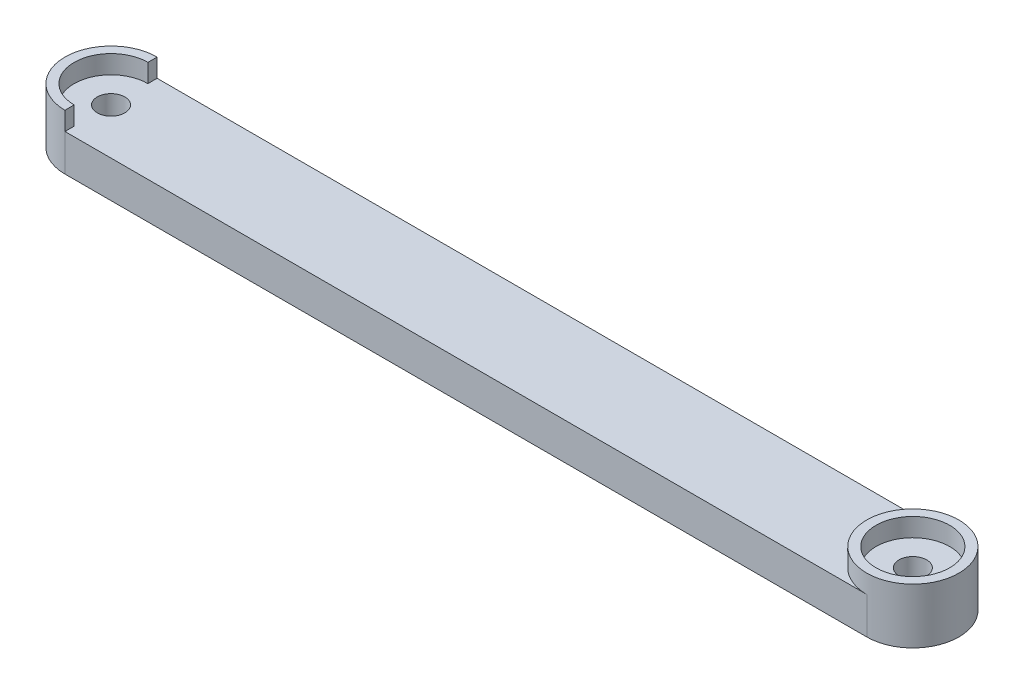
ISO-10303-21;
HEADER;
FILE_DESCRIPTION(('STEP AP214'),'2;1');
FILE_NAME('part.step','',(''),(''),'','','');
FILE_SCHEMA(('AUTOMOTIVE_DESIGN { 1 0 10303 214 1 1 1 1 }'));
ENDSEC;
DATA;
#1=APPLICATION_CONTEXT('core data for automotive mechanical design processes');
#2=APPLICATION_PROTOCOL_DEFINITION('international standard','automotive_design',2000,#1);
#3=PRODUCT_CONTEXT('',#1,'mechanical');
#4=PRODUCT('Part','Part','',(#3));
#5=PRODUCT_RELATED_PRODUCT_CATEGORY('part','',(#4));
#6=PRODUCT_DEFINITION_FORMATION('','',#4);
#7=PRODUCT_DEFINITION_CONTEXT('part definition',#1,'design');
#8=PRODUCT_DEFINITION('design','',#6,#7);
#9=PRODUCT_DEFINITION_SHAPE('','',#8);
#10=(LENGTH_UNIT() NAMED_UNIT(*) SI_UNIT(.MILLI.,.METRE.));
#11=(NAMED_UNIT(*) PLANE_ANGLE_UNIT() SI_UNIT($,.RADIAN.));
#12=(NAMED_UNIT(*) SI_UNIT($,.STERADIAN.) SOLID_ANGLE_UNIT());
#13=UNCERTAINTY_MEASURE_WITH_UNIT(LENGTH_MEASURE(1.E-05),#10,'distance_accuracy_value','');
#14=(GEOMETRIC_REPRESENTATION_CONTEXT(3) GLOBAL_UNCERTAINTY_ASSIGNED_CONTEXT((#13)) GLOBAL_UNIT_ASSIGNED_CONTEXT((#10,
#11,#12)) REPRESENTATION_CONTEXT('',''));
#15=CARTESIAN_POINT('',(0.,0.,0.));
#16=DIRECTION('',(0.,0.,1.));
#17=DIRECTION('',(1.,0.,0.));
#18=AXIS2_PLACEMENT_3D('',#15,#16,#17);
#19=CARTESIAN_POINT('',(-21.75,2.,0.));
#20=DIRECTION('',(0.,1.,0.));
#21=DIRECTION('',(0.,0.,1.));
#22=AXIS2_PLACEMENT_3D('',#19,#20,#21);
#23=PLANE('',#22);
#24=CARTESIAN_POINT('',(21.75,2.,0.));
#25=DIRECTION('',(0.,1.,0.));
#26=DIRECTION('',(0.,0.,1.));
#27=AXIS2_PLACEMENT_3D('',#24,#25,#26);
#28=CIRCLE('',#27,0.750000000000002);
#29=CARTESIAN_POINT('',(21.75,2.,0.749999999999994));
#30=VERTEX_POINT('',#29);
#31=EDGE_CURVE('E148',#30,#30,#28,.T.);
#32=ORIENTED_EDGE('',*,*,#31,.F.);
#33=EDGE_LOOP('',(#32));
#34=FACE_BOUND('',#33,.T.);
#35=CARTESIAN_POINT('',(21.75,2.,0.));
#36=DIRECTION('',(0.,1.,0.));
#37=DIRECTION('',(0.,0.,1.));
#38=AXIS2_PLACEMENT_3D('',#35,#36,#37);
#39=CIRCLE('',#38,2.);
#40=CARTESIAN_POINT('',(21.75,2.,2.));
#41=VERTEX_POINT('',#40);
#42=EDGE_CURVE('E11',#41,#41,#39,.F.);
#43=ORIENTED_EDGE('',*,*,#42,.F.);
#44=EDGE_LOOP('',(#43));
#45=FACE_BOUND('',#44,.T.);
#46=ADVANCED_FACE('F33',(#34,#45),#23,.T.);
#47=DIRECTION('',(1.,0.,0.));
#48=VECTOR('',#47,1.);
#49=CARTESIAN_POINT('',(-21.75,2.,2.5));
#50=LINE('',#49,#48);
#51=CARTESIAN_POINT('',(-21.75,2.,2.5));
#52=VERTEX_POINT('',#51);
#53=CARTESIAN_POINT('',(21.75,2.,2.49999999999999));
#54=VERTEX_POINT('',#53);
#55=EDGE_CURVE('E99',#52,#54,#50,.T.);
#56=ORIENTED_EDGE('',*,*,#55,.T.);
#57=CARTESIAN_POINT('',(21.75,2.,0.));
#58=DIRECTION('',(0.,1.,0.));
#59=DIRECTION('',(0.,0.,1.));
#60=AXIS2_PLACEMENT_3D('',#57,#58,#59);
#61=CIRCLE('',#60,2.5);
#62=CARTESIAN_POINT('',(21.75,2.,-2.50000000000001));
#63=VERTEX_POINT('',#62);
#64=EDGE_CURVE('E106',#63,#54,#61,.T.);
#65=ORIENTED_EDGE('',*,*,#64,.F.);
#66=DIRECTION('',(-1.,0.,0.));
#67=VECTOR('',#66,1.);
#68=CARTESIAN_POINT('',(-21.75,2.,-2.5));
#69=LINE('',#68,#67);
#70=CARTESIAN_POINT('',(-21.75,2.,-2.5));
#71=VERTEX_POINT('',#70);
#72=EDGE_CURVE('E91',#63,#71,#69,.T.);
#73=ORIENTED_EDGE('',*,*,#72,.T.);
#74=DIRECTION('',(0.,0.,-1.));
#75=VECTOR('',#74,1.);
#76=CARTESIAN_POINT('',(-21.75,2.,-2.5));
#77=LINE('',#76,#75);
#78=CARTESIAN_POINT('',(-21.75,2.,-2.));
#79=VERTEX_POINT('',#78);
#80=EDGE_CURVE('E53',#79,#71,#77,.T.);
#81=ORIENTED_EDGE('',*,*,#80,.F.);
#82=CARTESIAN_POINT('',(-21.75,2.,0.));
#83=DIRECTION('',(0.,-1.,0.));
#84=DIRECTION('',(0.,0.,1.));
#85=AXIS2_PLACEMENT_3D('',#82,#83,#84);
#86=CIRCLE('',#85,2.);
#87=CARTESIAN_POINT('',(-21.75,2.,2.));
#88=VERTEX_POINT('',#87);
#89=EDGE_CURVE('E48',#88,#79,#86,.T.);
#90=ORIENTED_EDGE('',*,*,#89,.F.);
#91=DIRECTION('',(0.,0.,-1.));
#92=VECTOR('',#91,1.);
#93=CARTESIAN_POINT('',(-21.75,2.,2.));
#94=LINE('',#93,#92);
#95=EDGE_CURVE('E127',#52,#88,#94,.T.);
#96=ORIENTED_EDGE('',*,*,#95,.F.);
#97=EDGE_LOOP('',(#56,#65,#73,#81,#90,#96));
#98=FACE_BOUND('',#97,.T.);
#99=CARTESIAN_POINT('',(-21.75,2.,0.));
#100=DIRECTION('',(0.,1.,0.));
#101=DIRECTION('',(0.,0.,1.));
#102=AXIS2_PLACEMENT_3D('',#99,#100,#101);
#103=CIRCLE('',#102,0.750000000000002);
#104=CARTESIAN_POINT('',(-21.75,2.,0.750000000000002));
#105=VERTEX_POINT('',#104);
#106=EDGE_CURVE('E154',#105,#105,#103,.T.);
#107=ORIENTED_EDGE('',*,*,#106,.F.);
#108=EDGE_LOOP('',(#107));
#109=FACE_BOUND('',#108,.T.);
#110=ADVANCED_FACE('F111',(#98,#109),#23,.T.);
#111=CARTESIAN_POINT('',(-21.75,0.,0.));
#112=DIRECTION('',(0.,1.,0.));
#113=DIRECTION('',(0.,0.,1.));
#114=AXIS2_PLACEMENT_3D('',#111,#112,#113);
#115=PLANE('',#114);
#116=CARTESIAN_POINT('',(-21.75,0.,0.));
#117=DIRECTION('',(0.,1.,0.));
#118=DIRECTION('',(0.,0.,1.));
#119=AXIS2_PLACEMENT_3D('',#116,#117,#118);
#120=CIRCLE('',#119,2.5);
#121=CARTESIAN_POINT('',(-21.75,0.,-2.5));
#122=VERTEX_POINT('',#121);
#123=CARTESIAN_POINT('',(-21.75,0.,2.5));
#124=VERTEX_POINT('',#123);
#125=EDGE_CURVE('E157',#122,#124,#120,.T.);
#126=ORIENTED_EDGE('',*,*,#125,.F.);
#127=DIRECTION('',(-1.,0.,0.));
#128=VECTOR('',#127,1.);
#129=CARTESIAN_POINT('',(-21.75,0.,-2.5));
#130=LINE('',#129,#128);
#131=CARTESIAN_POINT('',(21.75,0.,-2.50000000000001));
#132=VERTEX_POINT('',#131);
#133=EDGE_CURVE('E160',#132,#122,#130,.T.);
#134=ORIENTED_EDGE('',*,*,#133,.F.);
#135=CARTESIAN_POINT('',(21.75,0.,0.));
#136=DIRECTION('',(0.,1.,0.));
#137=DIRECTION('',(0.,0.,1.));
#138=AXIS2_PLACEMENT_3D('',#135,#136,#137);
#139=CIRCLE('',#138,2.5);
#140=CARTESIAN_POINT('',(21.75,0.,2.49999999999999));
#141=VERTEX_POINT('',#140);
#142=EDGE_CURVE('E108',#141,#132,#139,.T.);
#143=ORIENTED_EDGE('',*,*,#142,.F.);
#144=DIRECTION('',(1.,0.,0.));
#145=VECTOR('',#144,1.);
#146=CARTESIAN_POINT('',(-21.75,0.,2.5));
#147=LINE('',#146,#145);
#148=EDGE_CURVE('E164',#124,#141,#147,.T.);
#149=ORIENTED_EDGE('',*,*,#148,.F.);
#150=EDGE_LOOP('',(#126,#134,#143,#149));
#151=FACE_BOUND('',#150,.T.);
#152=CARTESIAN_POINT('',(-21.75,0.,0.));
#153=DIRECTION('',(0.,1.,0.));
#154=DIRECTION('',(0.,0.,1.));
#155=AXIS2_PLACEMENT_3D('',#152,#153,#154);
#156=CIRCLE('',#155,0.750000000000002);
#157=CARTESIAN_POINT('',(-21.75,0.,0.750000000000002));
#158=VERTEX_POINT('',#157);
#159=EDGE_CURVE('E151',#158,#158,#156,.T.);
#160=ORIENTED_EDGE('',*,*,#159,.T.);
#161=EDGE_LOOP('',(#160));
#162=FACE_BOUND('',#161,.T.);
#163=CARTESIAN_POINT('',(21.75,0.,0.));
#164=DIRECTION('',(0.,1.,0.));
#165=DIRECTION('',(0.,0.,1.));
#166=AXIS2_PLACEMENT_3D('',#163,#164,#165);
#167=CIRCLE('',#166,0.750000000000002);
#168=CARTESIAN_POINT('',(21.75,0.,0.749999999999994));
#169=VERTEX_POINT('',#168);
#170=EDGE_CURVE('E147',#169,#169,#167,.T.);
#171=ORIENTED_EDGE('',*,*,#170,.T.);
#172=EDGE_LOOP('',(#171));
#173=FACE_BOUND('',#172,.T.);
#174=ADVANCED_FACE('F177',(#151,#162,#173),#115,.F.);
#175=CARTESIAN_POINT('',(-21.75,2.,0.));
#176=DIRECTION('',(0.,-1.,0.));
#177=DIRECTION('',(0.,0.,-1.));
#178=AXIS2_PLACEMENT_3D('',#175,#176,#177);
#179=CYLINDRICAL_SURFACE('',#178,2.5);
#180=ORIENTED_EDGE('',*,*,#125,.T.);
#181=DIRECTION('',(0.,-1.,0.));
#182=VECTOR('',#181,1.);
#183=CARTESIAN_POINT('',(-21.75,2.,2.5));
#184=LINE('',#183,#182);
#185=EDGE_CURVE('E41',#52,#124,#184,.T.);
#186=ORIENTED_EDGE('',*,*,#185,.F.);
#187=DIRECTION('',(0.,-1.,0.));
#188=VECTOR('',#187,1.);
#189=CARTESIAN_POINT('',(-21.75,3.,2.5));
#190=LINE('',#189,#188);
#191=CARTESIAN_POINT('',(-21.75,3.,2.5));
#192=VERTEX_POINT('',#191);
#193=EDGE_CURVE('E139',#192,#52,#190,.T.);
#194=ORIENTED_EDGE('',*,*,#193,.F.);
#195=CARTESIAN_POINT('',(-21.75,3.,0.));
#196=DIRECTION('',(0.,1.,0.));
#197=DIRECTION('',(0.,0.,1.));
#198=AXIS2_PLACEMENT_3D('',#195,#196,#197);
#199=CIRCLE('',#198,2.5);
#200=CARTESIAN_POINT('',(-21.75,3.,-2.5));
#201=VERTEX_POINT('',#200);
#202=EDGE_CURVE('E129',#201,#192,#199,.T.);
#203=ORIENTED_EDGE('',*,*,#202,.F.);
#204=DIRECTION('',(0.,-1.,0.));
#205=VECTOR('',#204,1.);
#206=CARTESIAN_POINT('',(-21.75,3.,-2.5));
#207=LINE('',#206,#205);
#208=EDGE_CURVE('E142',#201,#71,#207,.T.);
#209=ORIENTED_EDGE('',*,*,#208,.T.);
#210=DIRECTION('',(0.,-1.,0.));
#211=VECTOR('',#210,1.);
#212=CARTESIAN_POINT('',(-21.75,2.,-2.5));
#213=LINE('',#212,#211);
#214=EDGE_CURVE('E97',#71,#122,#213,.T.);
#215=ORIENTED_EDGE('',*,*,#214,.T.);
#216=EDGE_LOOP('',(#180,#186,#194,#203,#209,#215));
#217=FACE_BOUND('',#216,.T.);
#218=ADVANCED_FACE('F35',(#217),#179,.T.);
#219=CARTESIAN_POINT('',(-21.75,2.,2.5));
#220=DIRECTION('',(0.,0.,-1.));
#221=DIRECTION('',(-1.,0.,0.));
#222=AXIS2_PLACEMENT_3D('',#219,#220,#221);
#223=PLANE('',#222);
#224=ORIENTED_EDGE('',*,*,#148,.T.);
#225=DIRECTION('',(0.,-1.,0.));
#226=VECTOR('',#225,1.);
#227=CARTESIAN_POINT('',(21.75,2.,2.49999999999999));
#228=LINE('',#227,#226);
#229=EDGE_CURVE('E109',#54,#141,#228,.T.);
#230=ORIENTED_EDGE('',*,*,#229,.F.);
#231=ORIENTED_EDGE('',*,*,#55,.F.);
#232=ORIENTED_EDGE('',*,*,#185,.T.);
#233=EDGE_LOOP('',(#224,#230,#231,#232));
#234=FACE_BOUND('',#233,.T.);
#235=ADVANCED_FACE('F172',(#234),#223,.F.);
#236=CARTESIAN_POINT('',(21.75,2.,0.));
#237=DIRECTION('',(0.,-1.,0.));
#238=DIRECTION('',(0.,0.,-1.));
#239=AXIS2_PLACEMENT_3D('',#236,#237,#238);
#240=CYLINDRICAL_SURFACE('',#239,2.5);
#241=ORIENTED_EDGE('',*,*,#142,.T.);
#242=DIRECTION('',(0.,-1.,0.));
#243=VECTOR('',#242,1.);
#244=CARTESIAN_POINT('',(21.75,2.,-2.50000000000001));
#245=LINE('',#244,#243);
#246=EDGE_CURVE('E94',#63,#132,#245,.T.);
#247=ORIENTED_EDGE('',*,*,#246,.F.);
#248=ORIENTED_EDGE('',*,*,#64,.T.);
#249=ORIENTED_EDGE('',*,*,#229,.T.);
#250=EDGE_LOOP('',(#241,#247,#248,#249));
#251=FACE_BOUND('',#250,.T.);
#252=CARTESIAN_POINT('',(21.75,3.,0.));
#253=DIRECTION('',(0.,1.,0.));
#254=DIRECTION('',(0.,0.,1.));
#255=AXIS2_PLACEMENT_3D('',#252,#253,#254);
#256=CIRCLE('',#255,2.5);
#257=CARTESIAN_POINT('',(21.75,3.,2.49999999999999));
#258=VERTEX_POINT('',#257);
#259=EDGE_CURVE('E115',#258,#258,#256,.T.);
#260=ORIENTED_EDGE('',*,*,#259,.F.);
#261=EDGE_LOOP('',(#260));
#262=FACE_BOUND('',#261,.T.);
#263=ADVANCED_FACE('F103',(#251,#262),#240,.T.);
#264=CARTESIAN_POINT('',(-21.75,2.,-2.5));
#265=DIRECTION('',(0.,0.,1.));
#266=DIRECTION('',(1.,0.,0.));
#267=AXIS2_PLACEMENT_3D('',#264,#265,#266);
#268=PLANE('',#267);
#269=ORIENTED_EDGE('',*,*,#133,.T.);
#270=ORIENTED_EDGE('',*,*,#214,.F.);
#271=ORIENTED_EDGE('',*,*,#72,.F.);
#272=ORIENTED_EDGE('',*,*,#246,.T.);
#273=EDGE_LOOP('',(#269,#270,#271,#272));
#274=FACE_BOUND('',#273,.T.);
#275=ADVANCED_FACE('F93',(#274),#268,.F.);
#276=CARTESIAN_POINT('',(-21.75,2.,0.));
#277=DIRECTION('',(0.,-1.,0.));
#278=DIRECTION('',(0.,0.,-1.));
#279=AXIS2_PLACEMENT_3D('',#276,#277,#278);
#280=CYLINDRICAL_SURFACE('',#279,0.750000000000002);
#281=ORIENTED_EDGE('',*,*,#106,.T.);
#282=EDGE_LOOP('',(#281));
#283=FACE_BOUND('',#282,.T.);
#284=ORIENTED_EDGE('',*,*,#159,.F.);
#285=EDGE_LOOP('',(#284));
#286=FACE_BOUND('',#285,.T.);
#287=ADVANCED_FACE('F188',(#283,#286),#280,.F.);
#288=CARTESIAN_POINT('',(21.75,2.,0.));
#289=DIRECTION('',(0.,-1.,0.));
#290=DIRECTION('',(0.,0.,-1.));
#291=AXIS2_PLACEMENT_3D('',#288,#289,#290);
#292=CYLINDRICAL_SURFACE('',#291,0.750000000000002);
#293=ORIENTED_EDGE('',*,*,#31,.T.);
#294=EDGE_LOOP('',(#293));
#295=FACE_BOUND('',#294,.T.);
#296=ORIENTED_EDGE('',*,*,#170,.F.);
#297=EDGE_LOOP('',(#296));
#298=FACE_BOUND('',#297,.T.);
#299=ADVANCED_FACE('F185',(#295,#298),#292,.F.);
#300=CARTESIAN_POINT('',(-21.75,3.,0.));
#301=DIRECTION('',(0.,-1.,0.));
#302=DIRECTION('',(0.,0.,-1.));
#303=AXIS2_PLACEMENT_3D('',#300,#301,#302);
#304=CYLINDRICAL_SURFACE('',#303,2.);
#305=ORIENTED_EDGE('',*,*,#89,.T.);
#306=DIRECTION('',(0.,-1.,0.));
#307=VECTOR('',#306,1.);
#308=CARTESIAN_POINT('',(-21.75,3.,-2.));
#309=LINE('',#308,#307);
#310=CARTESIAN_POINT('',(-21.75,3.,-2.));
#311=VERTEX_POINT('',#310);
#312=EDGE_CURVE('E145',#311,#79,#309,.T.);
#313=ORIENTED_EDGE('',*,*,#312,.F.);
#314=CARTESIAN_POINT('',(-21.75,3.,0.));
#315=DIRECTION('',(0.,-1.,0.));
#316=DIRECTION('',(0.,0.,1.));
#317=AXIS2_PLACEMENT_3D('',#314,#315,#316);
#318=CIRCLE('',#317,2.);
#319=CARTESIAN_POINT('',(-21.75,3.,2.));
#320=VERTEX_POINT('',#319);
#321=EDGE_CURVE('E123',#320,#311,#318,.T.);
#322=ORIENTED_EDGE('',*,*,#321,.F.);
#323=DIRECTION('',(0.,-1.,0.));
#324=VECTOR('',#323,1.);
#325=CARTESIAN_POINT('',(-21.75,3.,2.));
#326=LINE('',#325,#324);
#327=EDGE_CURVE('E133',#320,#88,#326,.T.);
#328=ORIENTED_EDGE('',*,*,#327,.T.);
#329=EDGE_LOOP('',(#305,#313,#322,#328));
#330=FACE_BOUND('',#329,.T.);
#331=ADVANCED_FACE('F187',(#330),#304,.F.);
#332=CARTESIAN_POINT('',(-21.75,3.,-2.5));
#333=DIRECTION('',(-1.,0.,0.));
#334=DIRECTION('',(0.,0.,1.));
#335=AXIS2_PLACEMENT_3D('',#332,#333,#334);
#336=PLANE('',#335);
#337=ORIENTED_EDGE('',*,*,#80,.T.);
#338=ORIENTED_EDGE('',*,*,#208,.F.);
#339=DIRECTION('',(0.,0.,-1.));
#340=VECTOR('',#339,1.);
#341=CARTESIAN_POINT('',(-21.75,3.,-2.5));
#342=LINE('',#341,#340);
#343=EDGE_CURVE('E126',#311,#201,#342,.T.);
#344=ORIENTED_EDGE('',*,*,#343,.F.);
#345=ORIENTED_EDGE('',*,*,#312,.T.);
#346=EDGE_LOOP('',(#337,#338,#344,#345));
#347=FACE_BOUND('',#346,.T.);
#348=ADVANCED_FACE('F195',(#347),#336,.F.);
#349=CARTESIAN_POINT('',(-21.75,3.,2.));
#350=DIRECTION('',(-1.,0.,0.));
#351=DIRECTION('',(0.,0.,1.));
#352=AXIS2_PLACEMENT_3D('',#349,#350,#351);
#353=PLANE('',#352);
#354=ORIENTED_EDGE('',*,*,#95,.T.);
#355=ORIENTED_EDGE('',*,*,#327,.F.);
#356=DIRECTION('',(0.,0.,-1.));
#357=VECTOR('',#356,1.);
#358=CARTESIAN_POINT('',(-21.75,3.,2.));
#359=LINE('',#358,#357);
#360=EDGE_CURVE('E131',#192,#320,#359,.T.);
#361=ORIENTED_EDGE('',*,*,#360,.F.);
#362=ORIENTED_EDGE('',*,*,#193,.T.);
#363=EDGE_LOOP('',(#354,#355,#361,#362));
#364=FACE_BOUND('',#363,.T.);
#365=ADVANCED_FACE('F270',(#364),#353,.F.);
#366=CARTESIAN_POINT('',(-21.75,3.,0.));
#367=DIRECTION('',(0.,1.,0.));
#368=DIRECTION('',(0.,0.,1.));
#369=AXIS2_PLACEMENT_3D('',#366,#367,#368);
#370=PLANE('',#369);
#371=ORIENTED_EDGE('',*,*,#321,.T.);
#372=ORIENTED_EDGE('',*,*,#343,.T.);
#373=ORIENTED_EDGE('',*,*,#202,.T.);
#374=ORIENTED_EDGE('',*,*,#360,.T.);
#375=EDGE_LOOP('',(#371,#372,#373,#374));
#376=FACE_BOUND('',#375,.T.);
#377=ADVANCED_FACE('F280',(#376),#370,.T.);
#378=CARTESIAN_POINT('',(21.75,3.,0.));
#379=DIRECTION('',(0.,1.,0.));
#380=DIRECTION('',(0.,0.,1.));
#381=AXIS2_PLACEMENT_3D('',#378,#379,#380);
#382=PLANE('',#381);
#383=ORIENTED_EDGE('',*,*,#259,.T.);
#384=EDGE_LOOP('',(#383));
#385=FACE_BOUND('',#384,.T.);
#386=CARTESIAN_POINT('',(21.75,3.,0.));
#387=DIRECTION('',(0.,1.,0.));
#388=DIRECTION('',(0.,0.,1.));
#389=AXIS2_PLACEMENT_3D('',#386,#387,#388);
#390=CIRCLE('',#389,2.);
#391=CARTESIAN_POINT('',(21.75,3.,2.));
#392=VERTEX_POINT('',#391);
#393=EDGE_CURVE('E116',#392,#392,#390,.T.);
#394=ORIENTED_EDGE('',*,*,#393,.F.);
#395=EDGE_LOOP('',(#394));
#396=FACE_BOUND('',#395,.T.);
#397=ADVANCED_FACE('F291',(#385,#396),#382,.T.);
#398=CARTESIAN_POINT('',(21.75,3.,0.));
#399=DIRECTION('',(0.,-1.,0.));
#400=DIRECTION('',(0.,0.,-1.));
#401=AXIS2_PLACEMENT_3D('',#398,#399,#400);
#402=CYLINDRICAL_SURFACE('',#401,2.);
#403=ORIENTED_EDGE('',*,*,#393,.T.);
#404=EDGE_LOOP('',(#403));
#405=FACE_BOUND('',#404,.T.);
#406=ORIENTED_EDGE('',*,*,#42,.T.);
#407=EDGE_LOOP('',(#406));
#408=FACE_BOUND('',#407,.T.);
#409=ADVANCED_FACE('F301',(#405,#408),#402,.F.);
#410=CLOSED_SHELL('',(#46,#110,#174,#218,#235,#263,#275,#287,#299,#331,#348,#365,#377,#397,#409));
#411=MANIFOLD_SOLID_BREP('B2',#410);
#412=ADVANCED_BREP_SHAPE_REPRESENTATION('',(#18,#411),#14);
#413=SHAPE_DEFINITION_REPRESENTATION(#9,#412);
ENDSEC;
END-ISO-10303-21;
